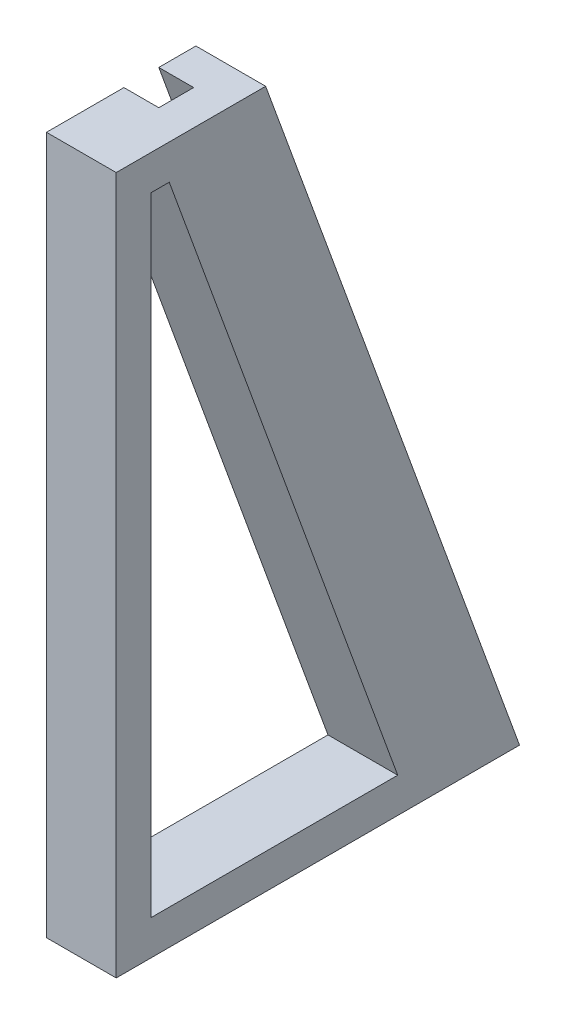
ISO-10303-21;
HEADER;
FILE_DESCRIPTION(('STEP AP214'),'2;1');
FILE_NAME('part.step','',(''),(''),'','','');
FILE_SCHEMA(('AUTOMOTIVE_DESIGN { 1 0 10303 214 1 1 1 1 }'));
ENDSEC;
DATA;
#1=APPLICATION_CONTEXT('core data for automotive mechanical design processes');
#2=APPLICATION_PROTOCOL_DEFINITION('international standard','automotive_design',2000,#1);
#3=PRODUCT_CONTEXT('',#1,'mechanical');
#4=PRODUCT('Part','Part','',(#3));
#5=PRODUCT_RELATED_PRODUCT_CATEGORY('part','',(#4));
#6=PRODUCT_DEFINITION_FORMATION('','',#4);
#7=PRODUCT_DEFINITION_CONTEXT('part definition',#1,'design');
#8=PRODUCT_DEFINITION('design','',#6,#7);
#9=PRODUCT_DEFINITION_SHAPE('','',#8);
#10=(LENGTH_UNIT() NAMED_UNIT(*) SI_UNIT(.MILLI.,.METRE.));
#11=(NAMED_UNIT(*) PLANE_ANGLE_UNIT() SI_UNIT($,.RADIAN.));
#12=(NAMED_UNIT(*) SI_UNIT($,.STERADIAN.) SOLID_ANGLE_UNIT());
#13=UNCERTAINTY_MEASURE_WITH_UNIT(LENGTH_MEASURE(1.E-05),#10,'distance_accuracy_value','');
#14=(GEOMETRIC_REPRESENTATION_CONTEXT(3) GLOBAL_UNCERTAINTY_ASSIGNED_CONTEXT((#13)) GLOBAL_UNIT_ASSIGNED_CONTEXT((#10,
#11,#12)) REPRESENTATION_CONTEXT('',''));
#15=CARTESIAN_POINT('',(0.,0.,0.));
#16=DIRECTION('',(0.,0.,1.));
#17=DIRECTION('',(1.,0.,0.));
#18=AXIS2_PLACEMENT_3D('',#15,#16,#17);
#19=CARTESIAN_POINT('',(10.,-50.,50.));
#20=DIRECTION('',(0.,1.,0.));
#21=DIRECTION('',(0.,0.,1.));
#22=AXIS2_PLACEMENT_3D('',#19,#20,#21);
#23=PLANE('',#22);
#24=DIRECTION('',(-1.,0.,0.));
#25=VECTOR('',#24,1.);
#26=CARTESIAN_POINT('',(0.,-50.,2.32088886));
#27=LINE('',#26,#25);
#28=CARTESIAN_POINT('',(8.,-50.,2.32088886));
#29=VERTEX_POINT('',#28);
#30=CARTESIAN_POINT('',(2.,-50.,2.32088886));
#31=VERTEX_POINT('',#30);
#32=EDGE_CURVE('E216',#29,#31,#27,.T.);
#33=ORIENTED_EDGE('',*,*,#32,.T.);
#34=DIRECTION('',(0.,0.,-1.));
#35=VECTOR('',#34,1.);
#36=CARTESIAN_POINT('',(2.,-50.,0.));
#37=LINE('',#36,#35);
#38=CARTESIAN_POINT('',(2.,-50.,8.32088886));
#39=VERTEX_POINT('',#38);
#40=EDGE_CURVE('E251',#39,#31,#37,.T.);
#41=ORIENTED_EDGE('',*,*,#40,.F.);
#42=DIRECTION('',(-1.,0.,0.));
#43=VECTOR('',#42,1.);
#44=CARTESIAN_POINT('',(0.,-50.,8.32088886));
#45=LINE('',#44,#43);
#46=CARTESIAN_POINT('',(8.,-50.,8.32088886));
#47=VERTEX_POINT('',#46);
#48=EDGE_CURVE('E265',#47,#39,#45,.T.);
#49=ORIENTED_EDGE('',*,*,#48,.F.);
#50=DIRECTION('',(0.,0.,-1.));
#51=VECTOR('',#50,1.);
#52=CARTESIAN_POINT('',(8.00000000000001,-50.,0.));
#53=LINE('',#52,#51);
#54=EDGE_CURVE('E262',#47,#29,#53,.T.);
#55=ORIENTED_EDGE('',*,*,#54,.T.);
#56=EDGE_LOOP('',(#33,#41,#49,#55));
#57=FACE_BOUND('',#56,.T.);
#58=DIRECTION('',(0.,0.,-1.));
#59=VECTOR('',#58,1.);
#60=CARTESIAN_POINT('',(2.00000000000001,-50.,0.));
#61=LINE('',#60,#59);
#62=CARTESIAN_POINT('',(2.,-50.,48.));
#63=VERTEX_POINT('',#62);
#64=CARTESIAN_POINT('',(2.,-50.,42.));
#65=VERTEX_POINT('',#64);
#66=EDGE_CURVE('E231',#63,#65,#61,.T.);
#67=ORIENTED_EDGE('',*,*,#66,.F.);
#68=DIRECTION('',(-1.,0.,0.));
#69=VECTOR('',#68,1.);
#70=CARTESIAN_POINT('',(0.,-50.,48.));
#71=LINE('',#70,#69);
#72=CARTESIAN_POINT('',(8.,-50.,48.));
#73=VERTEX_POINT('',#72);
#74=EDGE_CURVE('E59',#73,#63,#71,.T.);
#75=ORIENTED_EDGE('',*,*,#74,.F.);
#76=DIRECTION('',(0.,0.,-1.));
#77=VECTOR('',#76,1.);
#78=CARTESIAN_POINT('',(8.,-50.,0.));
#79=LINE('',#78,#77);
#80=CARTESIAN_POINT('',(8.,-50.,42.));
#81=VERTEX_POINT('',#80);
#82=EDGE_CURVE('E222',#73,#81,#79,.T.);
#83=ORIENTED_EDGE('',*,*,#82,.T.);
#84=DIRECTION('',(-1.,0.,0.));
#85=VECTOR('',#84,1.);
#86=CARTESIAN_POINT('',(0.,-50.,42.));
#87=LINE('',#86,#85);
#88=EDGE_CURVE('E235',#81,#65,#87,.T.);
#89=ORIENTED_EDGE('',*,*,#88,.T.);
#90=EDGE_LOOP('',(#67,#75,#83,#89));
#91=FACE_BOUND('',#90,.T.);
#92=DIRECTION('',(-1.,0.,0.));
#93=VECTOR('',#92,1.);
#94=CARTESIAN_POINT('',(10.,-50.,-7.82088886237959));
#95=LINE('',#94,#93);
#96=CARTESIAN_POINT('',(10.,-50.,-7.82088886237959));
#97=VERTEX_POINT('',#96);
#98=CARTESIAN_POINT('',(0.,-50.,-7.82088886237959));
#99=VERTEX_POINT('',#98);
#100=EDGE_CURVE('E178',#97,#99,#95,.T.);
#101=ORIENTED_EDGE('',*,*,#100,.F.);
#102=DIRECTION('',(0.,0.,-1.));
#103=VECTOR('',#102,1.);
#104=CARTESIAN_POINT('',(10.,-50.,50.));
#105=LINE('',#104,#103);
#106=CARTESIAN_POINT('',(10.,-50.,50.));
#107=VERTEX_POINT('',#106);
#108=EDGE_CURVE('E186',#107,#97,#105,.T.);
#109=ORIENTED_EDGE('',*,*,#108,.F.);
#110=DIRECTION('',(-1.,0.,0.));
#111=VECTOR('',#110,1.);
#112=CARTESIAN_POINT('',(10.,-50.,50.));
#113=LINE('',#112,#111);
#114=CARTESIAN_POINT('',(0.,-50.,50.));
#115=VERTEX_POINT('',#114);
#116=EDGE_CURVE('E44',#107,#115,#113,.T.);
#117=ORIENTED_EDGE('',*,*,#116,.T.);
#118=DIRECTION('',(0.,0.,-1.));
#119=VECTOR('',#118,1.);
#120=CARTESIAN_POINT('',(0.,-50.,50.));
#121=LINE('',#120,#119);
#122=EDGE_CURVE('E190',#115,#99,#121,.T.);
#123=ORIENTED_EDGE('',*,*,#122,.T.);
#124=EDGE_LOOP('',(#101,#109,#117,#123));
#125=FACE_BOUND('',#124,.T.);
#126=ADVANCED_FACE('F36',(#57,#91,#125),#23,.F.);
#127=CARTESIAN_POINT('',(10.,0.,0.));
#128=DIRECTION('',(1.,0.,0.));
#129=DIRECTION('',(0.,0.,-1.));
#130=AXIS2_PLACEMENT_3D('',#127,#128,#129);
#131=PLANE('',#130);
#132=DIRECTION('',(0.,-1.,0.));
#133=VECTOR('',#132,1.);
#134=CARTESIAN_POINT('',(10.,0.,45.));
#135=LINE('',#134,#133);
#136=CARTESIAN_POINT('',(10.,45.,45.));
#137=VERTEX_POINT('',#136);
#138=CARTESIAN_POINT('',(10.,-45.,45.));
#139=VERTEX_POINT('',#138);
#140=EDGE_CURVE('E315',#137,#139,#135,.T.);
#141=ORIENTED_EDGE('',*,*,#140,.F.);
#142=DIRECTION('',(0.,0.,1.));
#143=VECTOR('',#142,1.);
#144=CARTESIAN_POINT('',(10.,45.0000000000001,1.20006748735049E-13));
#145=LINE('',#144,#143);
#146=CARTESIAN_POINT('',(10.,45.,42.3980611176692));
#147=VERTEX_POINT('',#146);
#148=EDGE_CURVE('E307',#147,#137,#145,.T.);
#149=ORIENTED_EDGE('',*,*,#148,.F.);
#150=DIRECTION('',(0.,0.939692620785907,0.342020143325672));
#151=VECTOR('',#150,1.);
#152=CARTESIAN_POINT('',(10.,-8.36247415076222,22.9757088999919));
#153=LINE('',#152,#151);
#154=CARTESIAN_POINT('',(10.,-45.,9.64074003371058));
#155=VERTEX_POINT('',#154);
#156=EDGE_CURVE('E309',#155,#147,#153,.T.);
#157=ORIENTED_EDGE('',*,*,#156,.F.);
#158=DIRECTION('',(0.,0.,-1.));
#159=VECTOR('',#158,1.);
#160=CARTESIAN_POINT('',(10.,-45.,0.));
#161=LINE('',#160,#159);
#162=EDGE_CURVE('E312',#139,#155,#161,.T.);
#163=ORIENTED_EDGE('',*,*,#162,.F.);
#164=EDGE_LOOP('',(#141,#149,#157,#163));
#165=FACE_BOUND('',#164,.T.);
#166=ORIENTED_EDGE('',*,*,#108,.T.);
#167=DIRECTION('',(0.,-0.939692620785907,-0.342020143325673));
#168=VECTOR('',#167,1.);
#169=CARTESIAN_POINT('',(10.,-3.33530369328915,9.1636715843354));
#170=LINE('',#169,#168);
#171=CARTESIAN_POINT('',(10.,50.,28.5761345642411));
#172=VERTEX_POINT('',#171);
#173=EDGE_CURVE('E173',#172,#97,#170,.T.);
#174=ORIENTED_EDGE('',*,*,#173,.F.);
#175=DIRECTION('',(0.,0.,1.));
#176=VECTOR('',#175,1.);
#177=CARTESIAN_POINT('',(10.,50.,50.));
#178=LINE('',#177,#176);
#179=CARTESIAN_POINT('',(10.,50.,50.));
#180=VERTEX_POINT('',#179);
#181=EDGE_CURVE('E183',#172,#180,#178,.T.);
#182=ORIENTED_EDGE('',*,*,#181,.T.);
#183=DIRECTION('',(0.,-1.,0.));
#184=VECTOR('',#183,1.);
#185=CARTESIAN_POINT('',(10.,50.,50.));
#186=LINE('',#185,#184);
#187=EDGE_CURVE('E189',#180,#107,#186,.T.);
#188=ORIENTED_EDGE('',*,*,#187,.T.);
#189=EDGE_LOOP('',(#166,#174,#182,#188));
#190=FACE_BOUND('',#189,.T.);
#191=ADVANCED_FACE('F182',(#165,#190),#131,.T.);
#192=CARTESIAN_POINT('',(0.,0.,0.));
#193=DIRECTION('',(1.,0.,0.));
#194=DIRECTION('',(0.,0.,-1.));
#195=AXIS2_PLACEMENT_3D('',#192,#193,#194);
#196=PLANE('',#195);
#197=DIRECTION('',(0.,0.,1.));
#198=VECTOR('',#197,1.);
#199=CARTESIAN_POINT('',(0.,45.0000000000001,1.20006748735049E-13));
#200=LINE('',#199,#198);
#201=CARTESIAN_POINT('',(0.,45.,42.3980611176692));
#202=VERTEX_POINT('',#201);
#203=CARTESIAN_POINT('',(0.,45.,45.));
#204=VERTEX_POINT('',#203);
#205=EDGE_CURVE('E300',#202,#204,#200,.T.);
#206=ORIENTED_EDGE('',*,*,#205,.T.);
#207=DIRECTION('',(0.,-1.,0.));
#208=VECTOR('',#207,1.);
#209=CARTESIAN_POINT('',(0.,0.,45.));
#210=LINE('',#209,#208);
#211=CARTESIAN_POINT('',(0.,-45.,45.));
#212=VERTEX_POINT('',#211);
#213=EDGE_CURVE('E310',#204,#212,#210,.T.);
#214=ORIENTED_EDGE('',*,*,#213,.T.);
#215=DIRECTION('',(0.,0.,-1.));
#216=VECTOR('',#215,1.);
#217=CARTESIAN_POINT('',(0.,-45.,0.));
#218=LINE('',#217,#216);
#219=CARTESIAN_POINT('',(0.,-45.,9.64074003371059));
#220=VERTEX_POINT('',#219);
#221=EDGE_CURVE('E322',#212,#220,#218,.T.);
#222=ORIENTED_EDGE('',*,*,#221,.T.);
#223=DIRECTION('',(0.,0.939692620785907,0.342020143325672));
#224=VECTOR('',#223,1.);
#225=CARTESIAN_POINT('',(0.,-8.36247415076222,22.9757088999919));
#226=LINE('',#225,#224);
#227=EDGE_CURVE('E319',#220,#202,#226,.T.);
#228=ORIENTED_EDGE('',*,*,#227,.T.);
#229=EDGE_LOOP('',(#206,#214,#222,#228));
#230=FACE_BOUND('',#229,.T.);
#231=DIRECTION('',(0.,-0.939692620785907,-0.342020143325673));
#232=VECTOR('',#231,1.);
#233=CARTESIAN_POINT('',(0.,-3.33530369328915,9.1636715843354));
#234=LINE('',#233,#232);
#235=CARTESIAN_POINT('',(0.,50.,28.5761345642411));
#236=VERTEX_POINT('',#235);
#237=EDGE_CURVE('E51',#236,#99,#234,.T.);
#238=ORIENTED_EDGE('',*,*,#237,.T.);
#239=ORIENTED_EDGE('',*,*,#122,.F.);
#240=DIRECTION('',(0.,-1.,0.));
#241=VECTOR('',#240,1.);
#242=CARTESIAN_POINT('',(0.,50.,50.));
#243=LINE('',#242,#241);
#244=CARTESIAN_POINT('',(0.,50.,50.));
#245=VERTEX_POINT('',#244);
#246=EDGE_CURVE('E194',#245,#115,#243,.T.);
#247=ORIENTED_EDGE('',*,*,#246,.F.);
#248=DIRECTION('',(0.,0.,1.));
#249=VECTOR('',#248,1.);
#250=CARTESIAN_POINT('',(0.,50.,50.));
#251=LINE('',#250,#249);
#252=CARTESIAN_POINT('',(0.,50.,38.8970234266207));
#253=VERTEX_POINT('',#252);
#254=EDGE_CURVE('E203',#253,#245,#251,.T.);
#255=ORIENTED_EDGE('',*,*,#254,.F.);
#256=DIRECTION('',(0.,-0.939692620785907,-0.342020143325673));
#257=VECTOR('',#256,1.);
#258=CARTESIAN_POINT('',(0.,-6.65237343413386,18.2772457960623));
#259=LINE('',#258,#257);
#260=CARTESIAN_POINT('',(0.,-45.,4.31985117133102));
#261=VERTEX_POINT('',#260);
#262=EDGE_CURVE('E281',#253,#261,#259,.T.);
#263=ORIENTED_EDGE('',*,*,#262,.T.);
#264=DIRECTION('',(0.,0.,1.));
#265=VECTOR('',#264,1.);
#266=CARTESIAN_POINT('',(0.,-45.,0.));
#267=LINE('',#266,#265);
#268=CARTESIAN_POINT('',(0.,-45.,-0.680148828668979));
#269=VERTEX_POINT('',#268);
#270=EDGE_CURVE('E292',#269,#261,#267,.T.);
#271=ORIENTED_EDGE('',*,*,#270,.F.);
#272=DIRECTION('',(0.,-0.939692620785907,-0.342020143325673));
#273=VECTOR('',#272,1.);
#274=CARTESIAN_POINT('',(0.,-5.0454044099175,13.8621346882649));
#275=LINE('',#274,#273);
#276=CARTESIAN_POINT('',(0.,50.,33.8970234266207));
#277=VERTEX_POINT('',#276);
#278=EDGE_CURVE('E242',#277,#269,#275,.T.);
#279=ORIENTED_EDGE('',*,*,#278,.F.);
#280=EDGE_CURVE('E201',#236,#277,#251,.T.);
#281=ORIENTED_EDGE('',*,*,#280,.F.);
#282=EDGE_LOOP('',(#238,#239,#247,#255,#263,#271,#279,#281));
#283=FACE_BOUND('',#282,.T.);
#284=ADVANCED_FACE('F211',(#230,#283),#196,.F.);
#285=CARTESIAN_POINT('',(10.,50.,50.));
#286=DIRECTION('',(0.,-1.,0.));
#287=DIRECTION('',(0.,0.,-1.));
#288=AXIS2_PLACEMENT_3D('',#285,#286,#287);
#289=PLANE('',#288);
#290=DIRECTION('',(-1.,0.,0.));
#291=VECTOR('',#290,1.);
#292=CARTESIAN_POINT('',(10.,50.,28.5761345642411));
#293=LINE('',#292,#291);
#294=EDGE_CURVE('E170',#172,#236,#293,.T.);
#295=ORIENTED_EDGE('',*,*,#294,.T.);
#296=ORIENTED_EDGE('',*,*,#280,.T.);
#297=DIRECTION('',(-1.,0.,0.));
#298=VECTOR('',#297,1.);
#299=CARTESIAN_POINT('',(5.,50.,33.8970234266207));
#300=LINE('',#299,#298);
#301=CARTESIAN_POINT('',(5.,50.,33.8970234266207));
#302=VERTEX_POINT('',#301);
#303=EDGE_CURVE('E297',#302,#277,#300,.T.);
#304=ORIENTED_EDGE('',*,*,#303,.F.);
#305=DIRECTION('',(0.,0.,-1.));
#306=VECTOR('',#305,1.);
#307=CARTESIAN_POINT('',(5.,50.,0.));
#308=LINE('',#307,#306);
#309=CARTESIAN_POINT('',(5.,50.,38.8970234266207));
#310=VERTEX_POINT('',#309);
#311=EDGE_CURVE('E286',#310,#302,#308,.T.);
#312=ORIENTED_EDGE('',*,*,#311,.F.);
#313=DIRECTION('',(-1.,0.,0.));
#314=VECTOR('',#313,1.);
#315=CARTESIAN_POINT('',(5.,50.,38.8970234266207));
#316=LINE('',#315,#314);
#317=EDGE_CURVE('E301',#310,#253,#316,.T.);
#318=ORIENTED_EDGE('',*,*,#317,.T.);
#319=ORIENTED_EDGE('',*,*,#254,.T.);
#320=DIRECTION('',(-1.,0.,0.));
#321=VECTOR('',#320,1.);
#322=CARTESIAN_POINT('',(10.,50.,50.));
#323=LINE('',#322,#321);
#324=EDGE_CURVE('E11',#180,#245,#323,.T.);
#325=ORIENTED_EDGE('',*,*,#324,.F.);
#326=ORIENTED_EDGE('',*,*,#181,.F.);
#327=EDGE_LOOP('',(#295,#296,#304,#312,#318,#319,#325,#326));
#328=FACE_BOUND('',#327,.T.);
#329=ADVANCED_FACE('F38',(#328),#289,.F.);
#330=CARTESIAN_POINT('',(10.,50.,50.));
#331=DIRECTION('',(0.,0.,-1.));
#332=DIRECTION('',(0.,1.,0.));
#333=AXIS2_PLACEMENT_3D('',#330,#331,#332);
#334=PLANE('',#333);
#335=ORIENTED_EDGE('',*,*,#246,.T.);
#336=ORIENTED_EDGE('',*,*,#116,.F.);
#337=ORIENTED_EDGE('',*,*,#187,.F.);
#338=ORIENTED_EDGE('',*,*,#324,.T.);
#339=EDGE_LOOP('',(#335,#336,#337,#338));
#340=FACE_BOUND('',#339,.T.);
#341=ADVANCED_FACE('F359',(#340),#334,.F.);
#342=CARTESIAN_POINT('',(10.,45.0000000000001,1.20006748735049E-13));
#343=DIRECTION('',(0.,-1.,0.));
#344=DIRECTION('',(0.,0.,-1.));
#345=AXIS2_PLACEMENT_3D('',#342,#343,#344);
#346=PLANE('',#345);
#347=ORIENTED_EDGE('',*,*,#205,.F.);
#348=DIRECTION('',(-1.,0.,0.));
#349=VECTOR('',#348,1.);
#350=CARTESIAN_POINT('',(10.,45.,42.3980611176692));
#351=LINE('',#350,#349);
#352=EDGE_CURVE('E197',#147,#202,#351,.T.);
#353=ORIENTED_EDGE('',*,*,#352,.F.);
#354=ORIENTED_EDGE('',*,*,#148,.T.);
#355=DIRECTION('',(-1.,0.,0.));
#356=VECTOR('',#355,1.);
#357=CARTESIAN_POINT('',(10.,45.,45.));
#358=LINE('',#357,#356);
#359=EDGE_CURVE('E327',#137,#204,#358,.T.);
#360=ORIENTED_EDGE('',*,*,#359,.T.);
#361=EDGE_LOOP('',(#347,#353,#354,#360));
#362=FACE_BOUND('',#361,.T.);
#363=ADVANCED_FACE('F350',(#362),#346,.T.);
#364=CARTESIAN_POINT('',(10.,0.,45.));
#365=DIRECTION('',(0.,0.,-1.));
#366=DIRECTION('',(-1.,0.,0.));
#367=AXIS2_PLACEMENT_3D('',#364,#365,#366);
#368=PLANE('',#367);
#369=ORIENTED_EDGE('',*,*,#213,.F.);
#370=ORIENTED_EDGE('',*,*,#359,.F.);
#371=ORIENTED_EDGE('',*,*,#140,.T.);
#372=DIRECTION('',(-1.,0.,0.));
#373=VECTOR('',#372,1.);
#374=CARTESIAN_POINT('',(10.,-45.,45.));
#375=LINE('',#374,#373);
#376=EDGE_CURVE('E330',#139,#212,#375,.T.);
#377=ORIENTED_EDGE('',*,*,#376,.T.);
#378=EDGE_LOOP('',(#369,#370,#371,#377));
#379=FACE_BOUND('',#378,.T.);
#380=ADVANCED_FACE('F351',(#379),#368,.T.);
#381=CARTESIAN_POINT('',(10.,-45.,0.));
#382=DIRECTION('',(0.,1.,0.));
#383=DIRECTION('',(0.,0.,1.));
#384=AXIS2_PLACEMENT_3D('',#381,#382,#383);
#385=PLANE('',#384);
#386=ORIENTED_EDGE('',*,*,#221,.F.);
#387=ORIENTED_EDGE('',*,*,#376,.F.);
#388=ORIENTED_EDGE('',*,*,#162,.T.);
#389=DIRECTION('',(-1.,0.,0.));
#390=VECTOR('',#389,1.);
#391=CARTESIAN_POINT('',(10.,-45.,9.64074003371059));
#392=LINE('',#391,#390);
#393=EDGE_CURVE('E331',#155,#220,#392,.T.);
#394=ORIENTED_EDGE('',*,*,#393,.T.);
#395=EDGE_LOOP('',(#386,#387,#388,#394));
#396=FACE_BOUND('',#395,.T.);
#397=ADVANCED_FACE('F344',(#396),#385,.T.);
#398=CARTESIAN_POINT('',(10.,-8.36247415076222,22.9757088999919));
#399=DIRECTION('',(0.,-0.342020143325672,0.939692620785907));
#400=DIRECTION('',(0.,-0.939692620785907,-0.342020143325672));
#401=AXIS2_PLACEMENT_3D('',#398,#399,#400);
#402=PLANE('',#401);
#403=ORIENTED_EDGE('',*,*,#227,.F.);
#404=ORIENTED_EDGE('',*,*,#393,.F.);
#405=ORIENTED_EDGE('',*,*,#156,.T.);
#406=ORIENTED_EDGE('',*,*,#352,.T.);
#407=EDGE_LOOP('',(#403,#404,#405,#406));
#408=FACE_BOUND('',#407,.T.);
#409=ADVANCED_FACE('F338',(#408),#402,.T.);
#410=CARTESIAN_POINT('',(5.,-5.0454044099175,13.8621346882649));
#411=DIRECTION('',(0.,0.342020143325673,-0.939692620785907));
#412=DIRECTION('',(0.,0.939692620785907,0.342020143325673));
#413=AXIS2_PLACEMENT_3D('',#410,#411,#412);
#414=PLANE('',#413);
#415=ORIENTED_EDGE('',*,*,#278,.T.);
#416=DIRECTION('',(-1.,0.,0.));
#417=VECTOR('',#416,1.);
#418=CARTESIAN_POINT('',(5.,-45.,-0.680148828668979));
#419=LINE('',#418,#417);
#420=CARTESIAN_POINT('',(5.,-45.,-0.680148828668979));
#421=VERTEX_POINT('',#420);
#422=EDGE_CURVE('E289',#421,#269,#419,.T.);
#423=ORIENTED_EDGE('',*,*,#422,.F.);
#424=DIRECTION('',(0.,-0.939692620785907,-0.342020143325673));
#425=VECTOR('',#424,1.);
#426=CARTESIAN_POINT('',(5.,-5.0454044099175,13.8621346882649));
#427=LINE('',#426,#425);
#428=EDGE_CURVE('E277',#302,#421,#427,.T.);
#429=ORIENTED_EDGE('',*,*,#428,.F.);
#430=ORIENTED_EDGE('',*,*,#303,.T.);
#431=EDGE_LOOP('',(#415,#423,#429,#430));
#432=FACE_BOUND('',#431,.T.);
#433=ADVANCED_FACE('F522',(#432),#414,.F.);
#434=CARTESIAN_POINT('',(5.,-6.65237343413386,18.2772457960623));
#435=DIRECTION('',(0.,0.342020143325673,-0.939692620785907));
#436=DIRECTION('',(0.,0.939692620785907,0.342020143325673));
#437=AXIS2_PLACEMENT_3D('',#434,#435,#436);
#438=PLANE('',#437);
#439=ORIENTED_EDGE('',*,*,#262,.F.);
#440=ORIENTED_EDGE('',*,*,#317,.F.);
#441=DIRECTION('',(0.,-0.939692620785907,-0.342020143325673));
#442=VECTOR('',#441,1.);
#443=CARTESIAN_POINT('',(5.,-6.65237343413386,18.2772457960623));
#444=LINE('',#443,#442);
#445=CARTESIAN_POINT('',(5.,-45.,4.31985117133102));
#446=VERTEX_POINT('',#445);
#447=EDGE_CURVE('E284',#310,#446,#444,.T.);
#448=ORIENTED_EDGE('',*,*,#447,.T.);
#449=DIRECTION('',(-1.,0.,0.));
#450=VECTOR('',#449,1.);
#451=CARTESIAN_POINT('',(5.,-45.,4.31985117133102));
#452=LINE('',#451,#450);
#453=EDGE_CURVE('E304',#446,#261,#452,.T.);
#454=ORIENTED_EDGE('',*,*,#453,.T.);
#455=EDGE_LOOP('',(#439,#440,#448,#454));
#456=FACE_BOUND('',#455,.T.);
#457=ADVANCED_FACE('F512',(#456),#438,.T.);
#458=CARTESIAN_POINT('',(5.,-45.,0.));
#459=DIRECTION('',(0.,-1.,0.));
#460=DIRECTION('',(0.,0.,-1.));
#461=AXIS2_PLACEMENT_3D('',#458,#459,#460);
#462=PLANE('',#461);
#463=ORIENTED_EDGE('',*,*,#270,.T.);
#464=ORIENTED_EDGE('',*,*,#453,.F.);
#465=DIRECTION('',(0.,0.,1.));
#466=VECTOR('',#465,1.);
#467=CARTESIAN_POINT('',(5.,-45.,0.));
#468=LINE('',#467,#466);
#469=EDGE_CURVE('E280',#421,#446,#468,.T.);
#470=ORIENTED_EDGE('',*,*,#469,.F.);
#471=ORIENTED_EDGE('',*,*,#422,.T.);
#472=EDGE_LOOP('',(#463,#464,#470,#471));
#473=FACE_BOUND('',#472,.T.);
#474=ADVANCED_FACE('F502',(#473),#462,.F.);
#475=CARTESIAN_POINT('',(5.,0.,0.));
#476=DIRECTION('',(-1.,0.,0.));
#477=DIRECTION('',(0.,0.,1.));
#478=AXIS2_PLACEMENT_3D('',#475,#476,#477);
#479=PLANE('',#478);
#480=ORIENTED_EDGE('',*,*,#428,.T.);
#481=ORIENTED_EDGE('',*,*,#469,.T.);
#482=ORIENTED_EDGE('',*,*,#447,.F.);
#483=ORIENTED_EDGE('',*,*,#311,.T.);
#484=EDGE_LOOP('',(#480,#481,#482,#483));
#485=FACE_BOUND('',#484,.T.);
#486=ADVANCED_FACE('F492',(#485),#479,.T.);
#487=CARTESIAN_POINT('',(0.,-46.,2.32088886));
#488=DIRECTION('',(0.,0.,1.));
#489=DIRECTION('',(1.,0.,0.));
#490=AXIS2_PLACEMENT_3D('',#487,#488,#489);
#491=PLANE('',#490);
#492=ORIENTED_EDGE('',*,*,#32,.F.);
#493=DIRECTION('',(0.,-1.,0.));
#494=VECTOR('',#493,1.);
#495=CARTESIAN_POINT('',(8.,-46.,2.32088886));
#496=LINE('',#495,#494);
#497=CARTESIAN_POINT('',(8.,-46.,2.32088886));
#498=VERTEX_POINT('',#497);
#499=EDGE_CURVE('E259',#498,#29,#496,.T.);
#500=ORIENTED_EDGE('',*,*,#499,.F.);
#501=DIRECTION('',(-1.,0.,0.));
#502=VECTOR('',#501,1.);
#503=CARTESIAN_POINT('',(0.,-46.,2.32088886));
#504=LINE('',#503,#502);
#505=CARTESIAN_POINT('',(2.,-46.,2.32088886));
#506=VERTEX_POINT('',#505);
#507=EDGE_CURVE('E248',#498,#506,#504,.T.);
#508=ORIENTED_EDGE('',*,*,#507,.T.);
#509=DIRECTION('',(0.,-1.,0.));
#510=VECTOR('',#509,1.);
#511=CARTESIAN_POINT('',(2.,-46.,2.32088886));
#512=LINE('',#511,#510);
#513=EDGE_CURVE('E232',#506,#31,#512,.T.);
#514=ORIENTED_EDGE('',*,*,#513,.T.);
#515=EDGE_LOOP('',(#492,#500,#508,#514));
#516=FACE_BOUND('',#515,.T.);
#517=ADVANCED_FACE('F482',(#516),#491,.T.);
#518=CARTESIAN_POINT('',(2.,-46.,0.));
#519=DIRECTION('',(-1.,0.,0.));
#520=DIRECTION('',(0.,0.,1.));
#521=AXIS2_PLACEMENT_3D('',#518,#519,#520);
#522=PLANE('',#521);
#523=ORIENTED_EDGE('',*,*,#40,.T.);
#524=ORIENTED_EDGE('',*,*,#513,.F.);
#525=DIRECTION('',(0.,0.,-1.));
#526=VECTOR('',#525,1.);
#527=CARTESIAN_POINT('',(2.,-46.,0.));
#528=LINE('',#527,#526);
#529=CARTESIAN_POINT('',(2.,-46.,8.32088886));
#530=VERTEX_POINT('',#529);
#531=EDGE_CURVE('E256',#530,#506,#528,.T.);
#532=ORIENTED_EDGE('',*,*,#531,.F.);
#533=DIRECTION('',(0.,-1.,0.));
#534=VECTOR('',#533,1.);
#535=CARTESIAN_POINT('',(2.,-46.,8.32088886));
#536=LINE('',#535,#534);
#537=EDGE_CURVE('E271',#530,#39,#536,.T.);
#538=ORIENTED_EDGE('',*,*,#537,.T.);
#539=EDGE_LOOP('',(#523,#524,#532,#538));
#540=FACE_BOUND('',#539,.T.);
#541=ADVANCED_FACE('F472',(#540),#522,.F.);
#542=CARTESIAN_POINT('',(0.,-46.,8.32088886));
#543=DIRECTION('',(0.,0.,1.));
#544=DIRECTION('',(1.,0.,0.));
#545=AXIS2_PLACEMENT_3D('',#542,#543,#544);
#546=PLANE('',#545);
#547=ORIENTED_EDGE('',*,*,#48,.T.);
#548=ORIENTED_EDGE('',*,*,#537,.F.);
#549=DIRECTION('',(-1.,0.,0.));
#550=VECTOR('',#549,1.);
#551=CARTESIAN_POINT('',(0.,-46.,8.32088886));
#552=LINE('',#551,#550);
#553=CARTESIAN_POINT('',(8.,-46.,8.32088886));
#554=VERTEX_POINT('',#553);
#555=EDGE_CURVE('E253',#554,#530,#552,.T.);
#556=ORIENTED_EDGE('',*,*,#555,.F.);
#557=DIRECTION('',(0.,-1.,0.));
#558=VECTOR('',#557,1.);
#559=CARTESIAN_POINT('',(8.,-46.,8.32088886));
#560=LINE('',#559,#558);
#561=EDGE_CURVE('E273',#554,#47,#560,.T.);
#562=ORIENTED_EDGE('',*,*,#561,.T.);
#563=EDGE_LOOP('',(#547,#548,#556,#562));
#564=FACE_BOUND('',#563,.T.);
#565=ADVANCED_FACE('F462',(#564),#546,.F.);
#566=CARTESIAN_POINT('',(8.00000000000001,-46.,0.));
#567=DIRECTION('',(-1.,0.,0.));
#568=DIRECTION('',(0.,0.,1.));
#569=AXIS2_PLACEMENT_3D('',#566,#567,#568);
#570=PLANE('',#569);
#571=ORIENTED_EDGE('',*,*,#54,.F.);
#572=ORIENTED_EDGE('',*,*,#561,.F.);
#573=DIRECTION('',(0.,0.,-1.));
#574=VECTOR('',#573,1.);
#575=CARTESIAN_POINT('',(8.00000000000001,-46.,0.));
#576=LINE('',#575,#574);
#577=EDGE_CURVE('E250',#554,#498,#576,.T.);
#578=ORIENTED_EDGE('',*,*,#577,.T.);
#579=ORIENTED_EDGE('',*,*,#499,.T.);
#580=EDGE_LOOP('',(#571,#572,#578,#579));
#581=FACE_BOUND('',#580,.T.);
#582=ADVANCED_FACE('F451',(#581),#570,.T.);
#583=CARTESIAN_POINT('',(0.,-46.,0.));
#584=DIRECTION('',(0.,-1.,0.));
#585=DIRECTION('',(0.,0.,-1.));
#586=AXIS2_PLACEMENT_3D('',#583,#584,#585);
#587=PLANE('',#586);
#588=ORIENTED_EDGE('',*,*,#507,.F.);
#589=ORIENTED_EDGE('',*,*,#577,.F.);
#590=ORIENTED_EDGE('',*,*,#555,.T.);
#591=ORIENTED_EDGE('',*,*,#531,.T.);
#592=EDGE_LOOP('',(#588,#589,#590,#591));
#593=FACE_BOUND('',#592,.T.);
#594=ADVANCED_FACE('F442',(#593),#587,.T.);
#595=CARTESIAN_POINT('',(0.,-46.,48.));
#596=DIRECTION('',(0.,0.,1.));
#597=DIRECTION('',(1.,0.,0.));
#598=AXIS2_PLACEMENT_3D('',#595,#596,#597);
#599=PLANE('',#598);
#600=ORIENTED_EDGE('',*,*,#74,.T.);
#601=DIRECTION('',(0.,-1.,0.));
#602=VECTOR('',#601,1.);
#603=CARTESIAN_POINT('',(2.,-46.,48.));
#604=LINE('',#603,#602);
#605=CARTESIAN_POINT('',(2.,-46.,48.));
#606=VERTEX_POINT('',#605);
#607=EDGE_CURVE('E229',#606,#63,#604,.T.);
#608=ORIENTED_EDGE('',*,*,#607,.F.);
#609=DIRECTION('',(-1.,0.,0.));
#610=VECTOR('',#609,1.);
#611=CARTESIAN_POINT('',(0.,-46.,48.));
#612=LINE('',#611,#610);
#613=CARTESIAN_POINT('',(8.,-46.,48.));
#614=VERTEX_POINT('',#613);
#615=EDGE_CURVE('E218',#614,#606,#612,.T.);
#616=ORIENTED_EDGE('',*,*,#615,.F.);
#617=DIRECTION('',(0.,-1.,0.));
#618=VECTOR('',#617,1.);
#619=CARTESIAN_POINT('',(8.,-46.,48.));
#620=LINE('',#619,#618);
#621=EDGE_CURVE('E240',#614,#73,#620,.T.);
#622=ORIENTED_EDGE('',*,*,#621,.T.);
#623=EDGE_LOOP('',(#600,#608,#616,#622));
#624=FACE_BOUND('',#623,.T.);
#625=ADVANCED_FACE('F432',(#624),#599,.F.);
#626=CARTESIAN_POINT('',(8.,-46.,0.));
#627=DIRECTION('',(-1.,0.,0.));
#628=DIRECTION('',(0.,0.,1.));
#629=AXIS2_PLACEMENT_3D('',#626,#627,#628);
#630=PLANE('',#629);
#631=ORIENTED_EDGE('',*,*,#82,.F.);
#632=ORIENTED_EDGE('',*,*,#621,.F.);
#633=DIRECTION('',(0.,0.,-1.));
#634=VECTOR('',#633,1.);
#635=CARTESIAN_POINT('',(8.,-46.,0.));
#636=LINE('',#635,#634);
#637=CARTESIAN_POINT('',(8.,-46.,42.));
#638=VERTEX_POINT('',#637);
#639=EDGE_CURVE('E227',#614,#638,#636,.T.);
#640=ORIENTED_EDGE('',*,*,#639,.T.);
#641=DIRECTION('',(0.,-1.,0.));
#642=VECTOR('',#641,1.);
#643=CARTESIAN_POINT('',(8.,-46.,42.));
#644=LINE('',#643,#642);
#645=EDGE_CURVE('E243',#638,#81,#644,.T.);
#646=ORIENTED_EDGE('',*,*,#645,.T.);
#647=EDGE_LOOP('',(#631,#632,#640,#646));
#648=FACE_BOUND('',#647,.T.);
#649=ADVANCED_FACE('F422',(#648),#630,.T.);
#650=CARTESIAN_POINT('',(0.,-46.,42.));
#651=DIRECTION('',(0.,0.,1.));
#652=DIRECTION('',(1.,0.,0.));
#653=AXIS2_PLACEMENT_3D('',#650,#651,#652);
#654=PLANE('',#653);
#655=ORIENTED_EDGE('',*,*,#88,.F.);
#656=ORIENTED_EDGE('',*,*,#645,.F.);
#657=DIRECTION('',(-1.,0.,0.));
#658=VECTOR('',#657,1.);
#659=CARTESIAN_POINT('',(0.,-46.,42.));
#660=LINE('',#659,#658);
#661=CARTESIAN_POINT('',(2.,-46.,42.));
#662=VERTEX_POINT('',#661);
#663=EDGE_CURVE('E225',#638,#662,#660,.T.);
#664=ORIENTED_EDGE('',*,*,#663,.T.);
#665=DIRECTION('',(0.,-1.,0.));
#666=VECTOR('',#665,1.);
#667=CARTESIAN_POINT('',(2.,-46.,42.));
#668=LINE('',#667,#666);
#669=EDGE_CURVE('E245',#662,#65,#668,.T.);
#670=ORIENTED_EDGE('',*,*,#669,.T.);
#671=EDGE_LOOP('',(#655,#656,#664,#670));
#672=FACE_BOUND('',#671,.T.);
#673=ADVANCED_FACE('F412',(#672),#654,.T.);
#674=CARTESIAN_POINT('',(2.00000000000001,-46.,0.));
#675=DIRECTION('',(-1.,0.,0.));
#676=DIRECTION('',(0.,0.,1.));
#677=AXIS2_PLACEMENT_3D('',#674,#675,#676);
#678=PLANE('',#677);
#679=ORIENTED_EDGE('',*,*,#66,.T.);
#680=ORIENTED_EDGE('',*,*,#669,.F.);
#681=DIRECTION('',(0.,0.,-1.));
#682=VECTOR('',#681,1.);
#683=CARTESIAN_POINT('',(2.00000000000001,-46.,0.));
#684=LINE('',#683,#682);
#685=EDGE_CURVE('E221',#606,#662,#684,.T.);
#686=ORIENTED_EDGE('',*,*,#685,.F.);
#687=ORIENTED_EDGE('',*,*,#607,.T.);
#688=EDGE_LOOP('',(#679,#680,#686,#687));
#689=FACE_BOUND('',#688,.T.);
#690=ADVANCED_FACE('F399',(#689),#678,.F.);
#691=CARTESIAN_POINT('',(0.,-46.,0.));
#692=DIRECTION('',(0.,-1.,0.));
#693=DIRECTION('',(0.,0.,-1.));
#694=AXIS2_PLACEMENT_3D('',#691,#692,#693);
#695=PLANE('',#694);
#696=ORIENTED_EDGE('',*,*,#615,.T.);
#697=ORIENTED_EDGE('',*,*,#685,.T.);
#698=ORIENTED_EDGE('',*,*,#663,.F.);
#699=ORIENTED_EDGE('',*,*,#639,.F.);
#700=EDGE_LOOP('',(#696,#697,#698,#699));
#701=FACE_BOUND('',#700,.T.);
#702=ADVANCED_FACE('F394',(#701),#695,.T.);
#703=CARTESIAN_POINT('',(10.,-3.33530369328915,9.1636715843354));
#704=DIRECTION('',(0.,0.342020143325673,-0.939692620785907));
#705=DIRECTION('',(0.,0.939692620785907,0.342020143325673));
#706=AXIS2_PLACEMENT_3D('',#703,#704,#705);
#707=PLANE('',#706);
#708=ORIENTED_EDGE('',*,*,#237,.F.);
#709=ORIENTED_EDGE('',*,*,#294,.F.);
#710=ORIENTED_EDGE('',*,*,#173,.T.);
#711=ORIENTED_EDGE('',*,*,#100,.T.);
#712=EDGE_LOOP('',(#708,#709,#710,#711));
#713=FACE_BOUND('',#712,.T.);
#714=ADVANCED_FACE('F172',(#713),#707,.T.);
#715=CLOSED_SHELL('',(#126,#191,#284,#329,#341,#363,#380,#397,#409,#433,#457,#474,#486,#517,
#541,#565,#582,#594,#625,#649,#673,#690,#702,#714));
#716=MANIFOLD_SOLID_BREP('B2',#715);
#717=ADVANCED_BREP_SHAPE_REPRESENTATION('',(#18,#716),#14);
#718=SHAPE_DEFINITION_REPRESENTATION(#9,#717);
ENDSEC;
END-ISO-10303-21;
